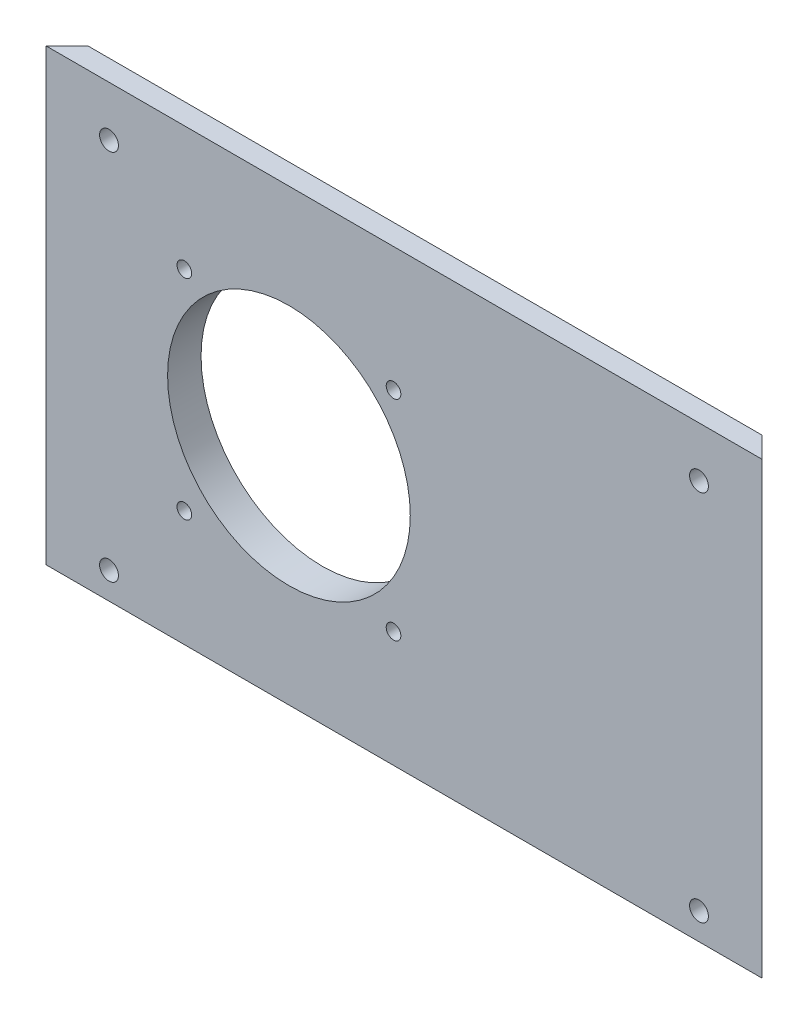
ISO-10303-21;
HEADER;
FILE_DESCRIPTION(('STEP AP214'),'2;1');
FILE_NAME('part.step','',(''),(''),'','','');
FILE_SCHEMA(('AUTOMOTIVE_DESIGN { 1 0 10303 214 1 1 1 1 }'));
ENDSEC;
DATA;
#1=APPLICATION_CONTEXT('core data for automotive mechanical design processes');
#2=APPLICATION_PROTOCOL_DEFINITION('international standard','automotive_design',2000,#1);
#3=PRODUCT_CONTEXT('',#1,'mechanical');
#4=PRODUCT('Part','Part','',(#3));
#5=PRODUCT_RELATED_PRODUCT_CATEGORY('part','',(#4));
#6=PRODUCT_DEFINITION_FORMATION('','',#4);
#7=PRODUCT_DEFINITION_CONTEXT('part definition',#1,'design');
#8=PRODUCT_DEFINITION('design','',#6,#7);
#9=PRODUCT_DEFINITION_SHAPE('','',#8);
#10=(LENGTH_UNIT() NAMED_UNIT(*) SI_UNIT(.MILLI.,.METRE.));
#11=(NAMED_UNIT(*) PLANE_ANGLE_UNIT() SI_UNIT($,.RADIAN.));
#12=(NAMED_UNIT(*) SI_UNIT($,.STERADIAN.) SOLID_ANGLE_UNIT());
#13=UNCERTAINTY_MEASURE_WITH_UNIT(LENGTH_MEASURE(1.E-05),#10,'distance_accuracy_value','');
#14=(GEOMETRIC_REPRESENTATION_CONTEXT(3) GLOBAL_UNCERTAINTY_ASSIGNED_CONTEXT((#13)) GLOBAL_UNIT_ASSIGNED_CONTEXT((#10,
#11,#12)) REPRESENTATION_CONTEXT('',''));
#15=CARTESIAN_POINT('',(0.,0.,0.));
#16=DIRECTION('',(0.,0.,1.));
#17=DIRECTION('',(1.,0.,0.));
#18=AXIS2_PLACEMENT_3D('',#15,#16,#17);
#19=CARTESIAN_POINT('',(0.,110.,-5.));
#20=DIRECTION('',(0.,1.,0.));
#21=DIRECTION('',(0.,0.,1.));
#22=AXIS2_PLACEMENT_3D('',#19,#20,#21);
#23=PLANE('',#22);
#24=DIRECTION('',(-0.707106781186546,0.,-0.707106781186549));
#25=VECTOR('',#24,1.);
#26=CARTESIAN_POINT('',(83.0000000000003,110.,-88.));
#27=LINE('',#26,#25);
#28=CARTESIAN_POINT('',(171.,110.,0.));
#29=VERTEX_POINT('',#28);
#30=CARTESIAN_POINT('',(166.,110.,-4.99999999999999));
#31=VERTEX_POINT('',#30);
#32=EDGE_CURVE('E130',#29,#31,#27,.T.);
#33=ORIENTED_EDGE('',*,*,#32,.T.);
#34=DIRECTION('',(-1.,0.,0.));
#35=VECTOR('',#34,1.);
#36=CARTESIAN_POINT('',(8.00000000000001,110.,-5.));
#37=LINE('',#36,#35);
#38=CARTESIAN_POINT('',(5.00000000000002,110.,-5.));
#39=VERTEX_POINT('',#38);
#40=EDGE_CURVE('E65',#31,#39,#37,.T.);
#41=ORIENTED_EDGE('',*,*,#40,.T.);
#42=DIRECTION('',(-0.707106781186546,0.,0.707106781186549));
#43=VECTOR('',#42,1.);
#44=CARTESIAN_POINT('',(2.50000000000002,110.,-2.49999999999999));
#45=LINE('',#44,#43);
#46=CARTESIAN_POINT('',(0.,110.,0.));
#47=VERTEX_POINT('',#46);
#48=EDGE_CURVE('E125',#39,#47,#45,.T.);
#49=ORIENTED_EDGE('',*,*,#48,.T.);
#50=DIRECTION('',(-1.,0.,0.));
#51=VECTOR('',#50,1.);
#52=CARTESIAN_POINT('',(0.,110.,0.));
#53=LINE('',#52,#51);
#54=EDGE_CURVE('E166',#29,#47,#53,.T.);
#55=ORIENTED_EDGE('',*,*,#54,.F.);
#56=EDGE_LOOP('',(#33,#41,#49,#55));
#57=FACE_BOUND('',#56,.T.);
#58=ADVANCED_FACE('F41',(#57),#23,.T.);
#59=CARTESIAN_POINT('',(0.,0.,-5.));
#60=DIRECTION('',(0.,0.,-1.));
#61=DIRECTION('',(-1.,0.,0.));
#62=AXIS2_PLACEMENT_3D('',#59,#60,#61);
#63=PLANE('',#62);
#64=DIRECTION('',(1.,0.,0.));
#65=VECTOR('',#64,1.);
#66=CARTESIAN_POINT('',(-5.,2.59999999999997,-4.99999999999988));
#67=LINE('',#66,#65);
#68=CARTESIAN_POINT('',(4.9999999999999,2.59999999999997,-4.99999999999988));
#69=VERTEX_POINT('',#68);
#70=CARTESIAN_POINT('',(166.,2.59999999999997,-4.99999999999988));
#71=VERTEX_POINT('',#70);
#72=EDGE_CURVE('E100',#69,#71,#67,.T.);
#73=ORIENTED_EDGE('',*,*,#72,.F.);
#74=DIRECTION('',(0.,1.,0.));
#75=VECTOR('',#74,1.);
#76=CARTESIAN_POINT('',(5.00000000000002,0.,-5.));
#77=LINE('',#76,#75);
#78=CARTESIAN_POINT('',(5.00000000000002,5.,-5.));
#79=VERTEX_POINT('',#78);
#80=EDGE_CURVE('E126',#69,#79,#77,.T.);
#81=ORIENTED_EDGE('',*,*,#80,.T.);
#82=DIRECTION('',(-1.,0.,0.));
#83=VECTOR('',#82,1.);
#84=CARTESIAN_POINT('',(0.,5.,-5.));
#85=LINE('',#84,#83);
#86=CARTESIAN_POINT('',(166.,4.99999999999997,-5.));
#87=VERTEX_POINT('',#86);
#88=EDGE_CURVE('E123',#87,#79,#85,.T.);
#89=ORIENTED_EDGE('',*,*,#88,.F.);
#90=DIRECTION('',(0.,-1.,0.));
#91=VECTOR('',#90,1.);
#92=CARTESIAN_POINT('',(166.,0.,-5.));
#93=LINE('',#92,#91);
#94=EDGE_CURVE('E114',#87,#71,#93,.T.);
#95=ORIENTED_EDGE('',*,*,#94,.T.);
#96=EDGE_LOOP('',(#73,#81,#89,#95));
#97=FACE_BOUND('',#96,.T.);
#98=ADVANCED_FACE('F121',(#97),#63,.T.);
#99=CARTESIAN_POINT('',(0.,0.,0.));
#100=DIRECTION('',(0.,0.,-1.));
#101=DIRECTION('',(-1.,0.,0.));
#102=AXIS2_PLACEMENT_3D('',#99,#100,#101);
#103=PLANE('',#102);
#104=CARTESIAN_POINT('',(33.0000000000004,30.3,0.));
#105=DIRECTION('',(0.,0.,1.));
#106=DIRECTION('',(1.,0.,0.));
#107=AXIS2_PLACEMENT_3D('',#104,#105,#106);
#108=CIRCLE('',#107,1.75);
#109=CARTESIAN_POINT('',(34.7500000000004,30.3,0.));
#110=VERTEX_POINT('',#109);
#111=EDGE_CURVE('E374',#110,#110,#108,.T.);
#112=ORIENTED_EDGE('',*,*,#111,.F.);
#113=EDGE_LOOP('',(#112));
#114=FACE_BOUND('',#113,.T.);
#115=CARTESIAN_POINT('',(83.0000000000004,30.3,0.));
#116=DIRECTION('',(0.,0.,1.));
#117=DIRECTION('',(1.,0.,0.));
#118=AXIS2_PLACEMENT_3D('',#115,#116,#117);
#119=CIRCLE('',#118,1.75);
#120=CARTESIAN_POINT('',(84.7500000000004,30.3,0.));
#121=VERTEX_POINT('',#120);
#122=EDGE_CURVE('E378',#121,#121,#119,.T.);
#123=ORIENTED_EDGE('',*,*,#122,.F.);
#124=EDGE_LOOP('',(#123));
#125=FACE_BOUND('',#124,.T.);
#126=CARTESIAN_POINT('',(82.9999999999999,80.3,0.));
#127=DIRECTION('',(0.,0.,1.));
#128=DIRECTION('',(1.,0.,0.));
#129=AXIS2_PLACEMENT_3D('',#126,#127,#128);
#130=CIRCLE('',#129,1.75);
#131=CARTESIAN_POINT('',(84.7499999999999,80.3,0.));
#132=VERTEX_POINT('',#131);
#133=EDGE_CURVE('E404',#132,#132,#130,.T.);
#134=ORIENTED_EDGE('',*,*,#133,.F.);
#135=EDGE_LOOP('',(#134));
#136=FACE_BOUND('',#135,.T.);
#137=CARTESIAN_POINT('',(32.9999999999999,80.3,0.));
#138=DIRECTION('',(0.,0.,1.));
#139=DIRECTION('',(1.,0.,0.));
#140=AXIS2_PLACEMENT_3D('',#137,#138,#139);
#141=CIRCLE('',#140,1.75);
#142=CARTESIAN_POINT('',(34.7499999999999,80.3,0.));
#143=VERTEX_POINT('',#142);
#144=EDGE_CURVE('E392',#143,#143,#141,.T.);
#145=ORIENTED_EDGE('',*,*,#144,.F.);
#146=EDGE_LOOP('',(#145));
#147=FACE_BOUND('',#146,.T.);
#148=CARTESIAN_POINT('',(57.9999999999999,56.3,0.));
#149=DIRECTION('',(0.,0.,1.));
#150=DIRECTION('',(1.,0.,0.));
#151=AXIS2_PLACEMENT_3D('',#148,#149,#150);
#152=CIRCLE('',#151,29.);
#153=CARTESIAN_POINT('',(86.9999999999999,56.3,0.));
#154=VERTEX_POINT('',#153);
#155=EDGE_CURVE('E384',#154,#154,#152,.T.);
#156=ORIENTED_EDGE('',*,*,#155,.F.);
#157=EDGE_LOOP('',(#156));
#158=FACE_BOUND('',#157,.T.);
#159=CARTESIAN_POINT('',(156.,98.,0.));
#160=DIRECTION('',(0.,0.,1.));
#161=DIRECTION('',(-1.,0.,0.));
#162=AXIS2_PLACEMENT_3D('',#159,#160,#161);
#163=CIRCLE('',#162,2.25000000000004);
#164=CARTESIAN_POINT('',(153.75,98.,0.));
#165=VERTEX_POINT('',#164);
#166=EDGE_CURVE('E187',#165,#165,#163,.T.);
#167=ORIENTED_EDGE('',*,*,#166,.F.);
#168=EDGE_LOOP('',(#167));
#169=FACE_BOUND('',#168,.T.);
#170=CARTESIAN_POINT('',(15.,98.,0.));
#171=DIRECTION('',(0.,0.,1.));
#172=DIRECTION('',(1.,0.,0.));
#173=AXIS2_PLACEMENT_3D('',#170,#171,#172);
#174=CIRCLE('',#173,2.25);
#175=CARTESIAN_POINT('',(17.25,98.,0.));
#176=VERTEX_POINT('',#175);
#177=EDGE_CURVE('E192',#176,#176,#174,.T.);
#178=ORIENTED_EDGE('',*,*,#177,.F.);
#179=EDGE_LOOP('',(#178));
#180=FACE_BOUND('',#179,.T.);
#181=CARTESIAN_POINT('',(156.,9.,0.));
#182=DIRECTION('',(0.,0.,1.));
#183=DIRECTION('',(-1.,0.,0.));
#184=AXIS2_PLACEMENT_3D('',#181,#182,#183);
#185=CIRCLE('',#184,2.25000000000004);
#186=CARTESIAN_POINT('',(153.75,9.,0.));
#187=VERTEX_POINT('',#186);
#188=EDGE_CURVE('E202',#187,#187,#185,.T.);
#189=ORIENTED_EDGE('',*,*,#188,.F.);
#190=EDGE_LOOP('',(#189));
#191=FACE_BOUND('',#190,.T.);
#192=CARTESIAN_POINT('',(15.,9.,0.));
#193=DIRECTION('',(0.,0.,1.));
#194=DIRECTION('',(1.,0.,0.));
#195=AXIS2_PLACEMENT_3D('',#192,#193,#194);
#196=CIRCLE('',#195,2.25);
#197=CARTESIAN_POINT('',(17.25,9.,0.));
#198=VERTEX_POINT('',#197);
#199=EDGE_CURVE('E206',#198,#198,#196,.T.);
#200=ORIENTED_EDGE('',*,*,#199,.F.);
#201=EDGE_LOOP('',(#200));
#202=FACE_BOUND('',#201,.T.);
#203=DIRECTION('',(0.,-1.,0.));
#204=VECTOR('',#203,1.);
#205=CARTESIAN_POINT('',(0.,0.,0.));
#206=LINE('',#205,#204);
#207=CARTESIAN_POINT('',(0.,2.59999999999997,0.));
#208=VERTEX_POINT('',#207);
#209=EDGE_CURVE('E175',#47,#208,#206,.T.);
#210=ORIENTED_EDGE('',*,*,#209,.T.);
#211=DIRECTION('',(1.,0.,0.));
#212=VECTOR('',#211,1.);
#213=CARTESIAN_POINT('',(0.,2.59999999999997,1.38777878078145E-13));
#214=LINE('',#213,#212);
#215=CARTESIAN_POINT('',(171.,2.59999999999997,1.38777878078145E-13));
#216=VERTEX_POINT('',#215);
#217=EDGE_CURVE('E57',#208,#216,#214,.T.);
#218=ORIENTED_EDGE('',*,*,#217,.T.);
#219=DIRECTION('',(0.,1.,0.));
#220=VECTOR('',#219,1.);
#221=CARTESIAN_POINT('',(171.,0.,0.));
#222=LINE('',#221,#220);
#223=EDGE_CURVE('E116',#216,#29,#222,.T.);
#224=ORIENTED_EDGE('',*,*,#223,.T.);
#225=ORIENTED_EDGE('',*,*,#54,.T.);
#226=EDGE_LOOP('',(#210,#218,#224,#225));
#227=FACE_BOUND('',#226,.T.);
#228=ADVANCED_FACE('F210',(#114,#125,#136,#147,#158,#169,#180,#191,#202,#227),#103,.F.);
#229=CARTESIAN_POINT('',(15.,9.,-5.));
#230=DIRECTION('',(0.,0.,1.));
#231=DIRECTION('',(1.,0.,0.));
#232=AXIS2_PLACEMENT_3D('',#229,#230,#231);
#233=CYLINDRICAL_SURFACE('',#232,2.25);
#234=ORIENTED_EDGE('',*,*,#199,.T.);
#235=EDGE_LOOP('',(#234));
#236=FACE_BOUND('',#235,.T.);
#237=CARTESIAN_POINT('',(15.,9.,-8.));
#238=DIRECTION('',(0.,0.,-1.));
#239=DIRECTION('',(-1.,0.,0.));
#240=AXIS2_PLACEMENT_3D('',#237,#238,#239);
#241=CIRCLE('',#240,2.25);
#242=CARTESIAN_POINT('',(12.75,9.,-8.));
#243=VERTEX_POINT('',#242);
#244=EDGE_CURVE('E222',#243,#243,#241,.T.);
#245=ORIENTED_EDGE('',*,*,#244,.T.);
#246=EDGE_LOOP('',(#245));
#247=FACE_BOUND('',#246,.T.);
#248=ADVANCED_FACE('F313',(#236,#247),#233,.F.);
#249=CARTESIAN_POINT('',(156.,9.,-5.));
#250=DIRECTION('',(0.,0.,1.));
#251=DIRECTION('',(1.,0.,0.));
#252=AXIS2_PLACEMENT_3D('',#249,#250,#251);
#253=CYLINDRICAL_SURFACE('',#252,2.25000000000004);
#254=ORIENTED_EDGE('',*,*,#188,.T.);
#255=EDGE_LOOP('',(#254));
#256=FACE_BOUND('',#255,.T.);
#257=CARTESIAN_POINT('',(156.,9.,-8.));
#258=DIRECTION('',(0.,0.,-1.));
#259=DIRECTION('',(-1.,0.,0.));
#260=AXIS2_PLACEMENT_3D('',#257,#258,#259);
#261=CIRCLE('',#260,2.25000000000004);
#262=CARTESIAN_POINT('',(153.75,9.,-8.));
#263=VERTEX_POINT('',#262);
#264=EDGE_CURVE('E216',#263,#263,#261,.T.);
#265=ORIENTED_EDGE('',*,*,#264,.T.);
#266=EDGE_LOOP('',(#265));
#267=FACE_BOUND('',#266,.T.);
#268=ADVANCED_FACE('F248',(#256,#267),#253,.F.);
#269=CARTESIAN_POINT('',(15.,98.,-5.));
#270=DIRECTION('',(0.,0.,1.));
#271=DIRECTION('',(1.,0.,0.));
#272=AXIS2_PLACEMENT_3D('',#269,#270,#271);
#273=CYLINDRICAL_SURFACE('',#272,2.25);
#274=ORIENTED_EDGE('',*,*,#177,.T.);
#275=EDGE_LOOP('',(#274));
#276=FACE_BOUND('',#275,.T.);
#277=CARTESIAN_POINT('',(15.,98.,-8.));
#278=DIRECTION('',(0.,0.,-1.));
#279=DIRECTION('',(-1.,0.,0.));
#280=AXIS2_PLACEMENT_3D('',#277,#278,#279);
#281=CIRCLE('',#280,2.25000000000001);
#282=CARTESIAN_POINT('',(12.75,98.,-8.));
#283=VERTEX_POINT('',#282);
#284=EDGE_CURVE('E194',#283,#283,#281,.T.);
#285=ORIENTED_EDGE('',*,*,#284,.T.);
#286=EDGE_LOOP('',(#285));
#287=FACE_BOUND('',#286,.T.);
#288=ADVANCED_FACE('F231',(#276,#287),#273,.F.);
#289=CARTESIAN_POINT('',(156.,98.,-5.));
#290=DIRECTION('',(0.,0.,1.));
#291=DIRECTION('',(1.,0.,0.));
#292=AXIS2_PLACEMENT_3D('',#289,#290,#291);
#293=CYLINDRICAL_SURFACE('',#292,2.25000000000004);
#294=ORIENTED_EDGE('',*,*,#166,.T.);
#295=EDGE_LOOP('',(#294));
#296=FACE_BOUND('',#295,.T.);
#297=CARTESIAN_POINT('',(156.,98.,-8.));
#298=DIRECTION('',(0.,0.,-1.));
#299=DIRECTION('',(-1.,0.,0.));
#300=AXIS2_PLACEMENT_3D('',#297,#298,#299);
#301=CIRCLE('',#300,2.25000000000004);
#302=CARTESIAN_POINT('',(153.75,98.,-8.));
#303=VERTEX_POINT('',#302);
#304=EDGE_CURVE('E212',#303,#303,#301,.T.);
#305=ORIENTED_EDGE('',*,*,#304,.T.);
#306=EDGE_LOOP('',(#305));
#307=FACE_BOUND('',#306,.T.);
#308=ADVANCED_FACE('F234',(#296,#307),#293,.F.);
#309=CARTESIAN_POINT('',(0.,0.,-8.));
#310=DIRECTION('',(0.,0.,1.));
#311=DIRECTION('',(1.,0.,0.));
#312=AXIS2_PLACEMENT_3D('',#309,#310,#311);
#313=PLANE('',#312);
#314=CARTESIAN_POINT('',(33.0000000000004,30.3,-8.));
#315=DIRECTION('',(0.,0.,1.));
#316=DIRECTION('',(1.,0.,0.));
#317=AXIS2_PLACEMENT_3D('',#314,#315,#316);
#318=CIRCLE('',#317,1.75);
#319=CARTESIAN_POINT('',(34.7500000000004,30.3,-8.));
#320=VERTEX_POINT('',#319);
#321=EDGE_CURVE('E371',#320,#320,#318,.T.);
#322=ORIENTED_EDGE('',*,*,#321,.T.);
#323=EDGE_LOOP('',(#322));
#324=FACE_BOUND('',#323,.T.);
#325=CARTESIAN_POINT('',(83.0000000000004,30.3,-8.));
#326=DIRECTION('',(0.,0.,1.));
#327=DIRECTION('',(1.,0.,0.));
#328=AXIS2_PLACEMENT_3D('',#325,#326,#327);
#329=CIRCLE('',#328,1.75);
#330=CARTESIAN_POINT('',(84.7500000000004,30.3,-8.));
#331=VERTEX_POINT('',#330);
#332=EDGE_CURVE('E408',#331,#331,#329,.T.);
#333=ORIENTED_EDGE('',*,*,#332,.T.);
#334=EDGE_LOOP('',(#333));
#335=FACE_BOUND('',#334,.T.);
#336=CARTESIAN_POINT('',(82.9999999999999,80.3,-8.));
#337=DIRECTION('',(0.,0.,1.));
#338=DIRECTION('',(1.,0.,0.));
#339=AXIS2_PLACEMENT_3D('',#336,#337,#338);
#340=CIRCLE('',#339,1.75);
#341=CARTESIAN_POINT('',(84.7499999999999,80.3,-8.));
#342=VERTEX_POINT('',#341);
#343=EDGE_CURVE('E398',#342,#342,#340,.T.);
#344=ORIENTED_EDGE('',*,*,#343,.T.);
#345=EDGE_LOOP('',(#344));
#346=FACE_BOUND('',#345,.T.);
#347=CARTESIAN_POINT('',(32.9999999999999,80.3,-8.));
#348=DIRECTION('',(0.,0.,1.));
#349=DIRECTION('',(1.,0.,0.));
#350=AXIS2_PLACEMENT_3D('',#347,#348,#349);
#351=CIRCLE('',#350,1.75);
#352=CARTESIAN_POINT('',(34.7499999999999,80.3,-8.));
#353=VERTEX_POINT('',#352);
#354=EDGE_CURVE('E387',#353,#353,#351,.T.);
#355=ORIENTED_EDGE('',*,*,#354,.T.);
#356=EDGE_LOOP('',(#355));
#357=FACE_BOUND('',#356,.T.);
#358=CARTESIAN_POINT('',(57.9999999999999,56.3,-8.));
#359=DIRECTION('',(0.,0.,1.));
#360=DIRECTION('',(1.,0.,0.));
#361=AXIS2_PLACEMENT_3D('',#358,#359,#360);
#362=CIRCLE('',#361,29.);
#363=CARTESIAN_POINT('',(86.9999999999999,56.3,-8.));
#364=VERTEX_POINT('',#363);
#365=EDGE_CURVE('E118',#364,#364,#362,.T.);
#366=ORIENTED_EDGE('',*,*,#365,.T.);
#367=EDGE_LOOP('',(#366));
#368=FACE_BOUND('',#367,.T.);
#369=DIRECTION('',(0.,1.,0.));
#370=VECTOR('',#369,1.);
#371=CARTESIAN_POINT('',(8.00000000000001,110.,-8.));
#372=LINE('',#371,#370);
#373=CARTESIAN_POINT('',(8.00000000000001,5.,-8.));
#374=VERTEX_POINT('',#373);
#375=CARTESIAN_POINT('',(8.00000000000001,107.,-8.));
#376=VERTEX_POINT('',#375);
#377=EDGE_CURVE('E153',#374,#376,#372,.T.);
#378=ORIENTED_EDGE('',*,*,#377,.T.);
#379=DIRECTION('',(1.,0.,0.));
#380=VECTOR('',#379,1.);
#381=CARTESIAN_POINT('',(163.,107.,-8.));
#382=LINE('',#381,#380);
#383=CARTESIAN_POINT('',(163.,107.,-8.));
#384=VERTEX_POINT('',#383);
#385=EDGE_CURVE('E138',#376,#384,#382,.T.);
#386=ORIENTED_EDGE('',*,*,#385,.T.);
#387=DIRECTION('',(0.,-1.,0.));
#388=VECTOR('',#387,1.);
#389=CARTESIAN_POINT('',(163.,4.99999999999997,-8.));
#390=LINE('',#389,#388);
#391=CARTESIAN_POINT('',(163.,4.99999999999997,-8.));
#392=VERTEX_POINT('',#391);
#393=EDGE_CURVE('E165',#384,#392,#390,.T.);
#394=ORIENTED_EDGE('',*,*,#393,.T.);
#395=DIRECTION('',(-1.,0.,0.));
#396=VECTOR('',#395,1.);
#397=CARTESIAN_POINT('',(0.,5.,-8.));
#398=LINE('',#397,#396);
#399=EDGE_CURVE('E163',#392,#374,#398,.T.);
#400=ORIENTED_EDGE('',*,*,#399,.T.);
#401=EDGE_LOOP('',(#378,#386,#394,#400));
#402=FACE_BOUND('',#401,.T.);
#403=ORIENTED_EDGE('',*,*,#284,.F.);
#404=EDGE_LOOP('',(#403));
#405=FACE_BOUND('',#404,.T.);
#406=ORIENTED_EDGE('',*,*,#244,.F.);
#407=EDGE_LOOP('',(#406));
#408=FACE_BOUND('',#407,.T.);
#409=ORIENTED_EDGE('',*,*,#264,.F.);
#410=EDGE_LOOP('',(#409));
#411=FACE_BOUND('',#410,.T.);
#412=ORIENTED_EDGE('',*,*,#304,.F.);
#413=EDGE_LOOP('',(#412));
#414=FACE_BOUND('',#413,.T.);
#415=ADVANCED_FACE('F159',(#324,#335,#346,#357,#368,#402,#405,#408,#411,#414),#313,.F.);
#416=CARTESIAN_POINT('',(0.,5.,-8.));
#417=DIRECTION('',(0.,1.,0.));
#418=DIRECTION('',(-1.,0.,0.));
#419=AXIS2_PLACEMENT_3D('',#416,#417,#418);
#420=PLANE('',#419);
#421=ORIENTED_EDGE('',*,*,#399,.F.);
#422=DIRECTION('',(0.707106781186546,0.,0.707106781186549));
#423=VECTOR('',#422,1.);
#424=CARTESIAN_POINT('',(163.,4.99999999999997,-8.));
#425=LINE('',#424,#423);
#426=EDGE_CURVE('E132',#392,#87,#425,.T.);
#427=ORIENTED_EDGE('',*,*,#426,.T.);
#428=ORIENTED_EDGE('',*,*,#88,.T.);
#429=DIRECTION('',(0.707106781186546,0.,-0.707106781186549));
#430=VECTOR('',#429,1.);
#431=CARTESIAN_POINT('',(8.00000000000001,5.,-8.));
#432=LINE('',#431,#430);
#433=EDGE_CURVE('E181',#79,#374,#432,.T.);
#434=ORIENTED_EDGE('',*,*,#433,.T.);
#435=EDGE_LOOP('',(#421,#427,#428,#434));
#436=FACE_BOUND('',#435,.T.);
#437=ADVANCED_FACE('F185',(#436),#420,.F.);
#438=CARTESIAN_POINT('',(163.,0.,-8.));
#439=DIRECTION('',(0.707106781186549,0.,-0.707106781186546));
#440=DIRECTION('',(0.,1.,0.));
#441=AXIS2_PLACEMENT_3D('',#438,#439,#440);
#442=PLANE('',#441);
#443=DIRECTION('',(0.707106781186547,0.,0.707106781186549));
#444=VECTOR('',#443,1.);
#445=CARTESIAN_POINT('',(171.,2.59999999999997,1.38777878078145E-13));
#446=LINE('',#445,#444);
#447=EDGE_CURVE('E103',#71,#216,#446,.T.);
#448=ORIENTED_EDGE('',*,*,#447,.F.);
#449=ORIENTED_EDGE('',*,*,#94,.F.);
#450=ORIENTED_EDGE('',*,*,#426,.F.);
#451=ORIENTED_EDGE('',*,*,#393,.F.);
#452=DIRECTION('',(0.577350269189626,0.577350269189623,0.577350269189628));
#453=VECTOR('',#452,1.);
#454=CARTESIAN_POINT('',(127.333333333333,71.3333333333337,-43.6666666666667));
#455=LINE('',#454,#453);
#456=EDGE_CURVE('E142',#384,#31,#455,.T.);
#457=ORIENTED_EDGE('',*,*,#456,.T.);
#458=ORIENTED_EDGE('',*,*,#32,.F.);
#459=ORIENTED_EDGE('',*,*,#223,.F.);
#460=EDGE_LOOP('',(#448,#449,#450,#451,#457,#458,#459));
#461=FACE_BOUND('',#460,.T.);
#462=ADVANCED_FACE('F112',(#461),#442,.T.);
#463=CARTESIAN_POINT('',(8.00000000000001,0.,-8.));
#464=DIRECTION('',(-0.707106781186549,0.,-0.707106781186546));
#465=DIRECTION('',(0.,-1.,0.));
#466=AXIS2_PLACEMENT_3D('',#463,#464,#465);
#467=PLANE('',#466);
#468=DIRECTION('',(0.707106781186546,0.,-0.707106781186549));
#469=VECTOR('',#468,1.);
#470=CARTESIAN_POINT('',(8.00000000000001,2.59999999999997,-8.));
#471=LINE('',#470,#469);
#472=EDGE_CURVE('E11',#208,#69,#471,.T.);
#473=ORIENTED_EDGE('',*,*,#472,.F.);
#474=ORIENTED_EDGE('',*,*,#209,.F.);
#475=ORIENTED_EDGE('',*,*,#48,.F.);
#476=DIRECTION('',(0.577350269189626,-0.577350269189623,-0.577350269189628));
#477=VECTOR('',#476,1.);
#478=CARTESIAN_POINT('',(43.6666666666665,71.3333333333337,-43.6666666666667));
#479=LINE('',#478,#477);
#480=EDGE_CURVE('E51',#39,#376,#479,.T.);
#481=ORIENTED_EDGE('',*,*,#480,.T.);
#482=ORIENTED_EDGE('',*,*,#377,.F.);
#483=ORIENTED_EDGE('',*,*,#433,.F.);
#484=ORIENTED_EDGE('',*,*,#80,.F.);
#485=EDGE_LOOP('',(#473,#474,#475,#481,#482,#483,#484));
#486=FACE_BOUND('',#485,.T.);
#487=ADVANCED_FACE('F151',(#486),#467,.T.);
#488=CARTESIAN_POINT('',(0.,107.,-8.));
#489=DIRECTION('',(0.,0.70710678118655,-0.707106781186545));
#490=DIRECTION('',(-1.,0.,0.));
#491=AXIS2_PLACEMENT_3D('',#488,#489,#490);
#492=PLANE('',#491);
#493=ORIENTED_EDGE('',*,*,#480,.F.);
#494=ORIENTED_EDGE('',*,*,#40,.F.);
#495=ORIENTED_EDGE('',*,*,#456,.F.);
#496=ORIENTED_EDGE('',*,*,#385,.F.);
#497=EDGE_LOOP('',(#493,#494,#495,#496));
#498=FACE_BOUND('',#497,.T.);
#499=ADVANCED_FACE('F44',(#498),#492,.T.);
#500=CARTESIAN_POINT('',(0.,2.59999999999997,1.38777878078145E-13));
#501=DIRECTION('',(0.,1.,0.));
#502=DIRECTION('',(-1.,0.,0.));
#503=AXIS2_PLACEMENT_3D('',#500,#501,#502);
#504=PLANE('',#503);
#505=ORIENTED_EDGE('',*,*,#472,.T.);
#506=ORIENTED_EDGE('',*,*,#72,.T.);
#507=ORIENTED_EDGE('',*,*,#447,.T.);
#508=ORIENTED_EDGE('',*,*,#217,.F.);
#509=EDGE_LOOP('',(#505,#506,#507,#508));
#510=FACE_BOUND('',#509,.T.);
#511=ADVANCED_FACE('F102',(#510),#504,.F.);
#512=CARTESIAN_POINT('',(57.9999999999999,56.3,-8.));
#513=DIRECTION('',(0.,0.,1.));
#514=DIRECTION('',(1.,0.,0.));
#515=AXIS2_PLACEMENT_3D('',#512,#513,#514);
#516=CYLINDRICAL_SURFACE('',#515,29.);
#517=ORIENTED_EDGE('',*,*,#365,.F.);
#518=EDGE_LOOP('',(#517));
#519=FACE_BOUND('',#518,.T.);
#520=ORIENTED_EDGE('',*,*,#155,.T.);
#521=EDGE_LOOP('',(#520));
#522=FACE_BOUND('',#521,.T.);
#523=ADVANCED_FACE('F274',(#519,#522),#516,.F.);
#524=CARTESIAN_POINT('',(32.9999999999999,80.3,-8.));
#525=DIRECTION('',(0.,0.,1.));
#526=DIRECTION('',(1.,0.,0.));
#527=AXIS2_PLACEMENT_3D('',#524,#525,#526);
#528=CYLINDRICAL_SURFACE('',#527,1.75);
#529=ORIENTED_EDGE('',*,*,#354,.F.);
#530=EDGE_LOOP('',(#529));
#531=FACE_BOUND('',#530,.T.);
#532=ORIENTED_EDGE('',*,*,#144,.T.);
#533=EDGE_LOOP('',(#532));
#534=FACE_BOUND('',#533,.T.);
#535=ADVANCED_FACE('F279',(#531,#534),#528,.F.);
#536=CARTESIAN_POINT('',(82.9999999999999,80.3,-8.));
#537=DIRECTION('',(0.,0.,1.));
#538=DIRECTION('',(1.,0.,0.));
#539=AXIS2_PLACEMENT_3D('',#536,#537,#538);
#540=CYLINDRICAL_SURFACE('',#539,1.75);
#541=ORIENTED_EDGE('',*,*,#343,.F.);
#542=EDGE_LOOP('',(#541));
#543=FACE_BOUND('',#542,.T.);
#544=ORIENTED_EDGE('',*,*,#133,.T.);
#545=EDGE_LOOP('',(#544));
#546=FACE_BOUND('',#545,.T.);
#547=ADVANCED_FACE('F335',(#543,#546),#540,.F.);
#548=CARTESIAN_POINT('',(83.0000000000004,30.3,-8.));
#549=DIRECTION('',(0.,0.,1.));
#550=DIRECTION('',(1.,0.,0.));
#551=AXIS2_PLACEMENT_3D('',#548,#549,#550);
#552=CYLINDRICAL_SURFACE('',#551,1.75);
#553=ORIENTED_EDGE('',*,*,#332,.F.);
#554=EDGE_LOOP('',(#553));
#555=FACE_BOUND('',#554,.T.);
#556=ORIENTED_EDGE('',*,*,#122,.T.);
#557=EDGE_LOOP('',(#556));
#558=FACE_BOUND('',#557,.T.);
#559=ADVANCED_FACE('F345',(#555,#558),#552,.F.);
#560=CARTESIAN_POINT('',(33.0000000000004,30.3,-8.));
#561=DIRECTION('',(0.,0.,1.));
#562=DIRECTION('',(1.,0.,0.));
#563=AXIS2_PLACEMENT_3D('',#560,#561,#562);
#564=CYLINDRICAL_SURFACE('',#563,1.75);
#565=ORIENTED_EDGE('',*,*,#321,.F.);
#566=EDGE_LOOP('',(#565));
#567=FACE_BOUND('',#566,.T.);
#568=ORIENTED_EDGE('',*,*,#111,.T.);
#569=EDGE_LOOP('',(#568));
#570=FACE_BOUND('',#569,.T.);
#571=ADVANCED_FACE('F355',(#567,#570),#564,.F.);
#572=CLOSED_SHELL('',(#58,#98,#228,#248,#268,#288,#308,#415,#437,#462,#487,#499,#511,#523,#535,
#547,#559,#571));
#573=MANIFOLD_SOLID_BREP('B2',#572);
#574=ADVANCED_BREP_SHAPE_REPRESENTATION('',(#18,#573),#14);
#575=SHAPE_DEFINITION_REPRESENTATION(#9,#574);
ENDSEC;
END-ISO-10303-21;
